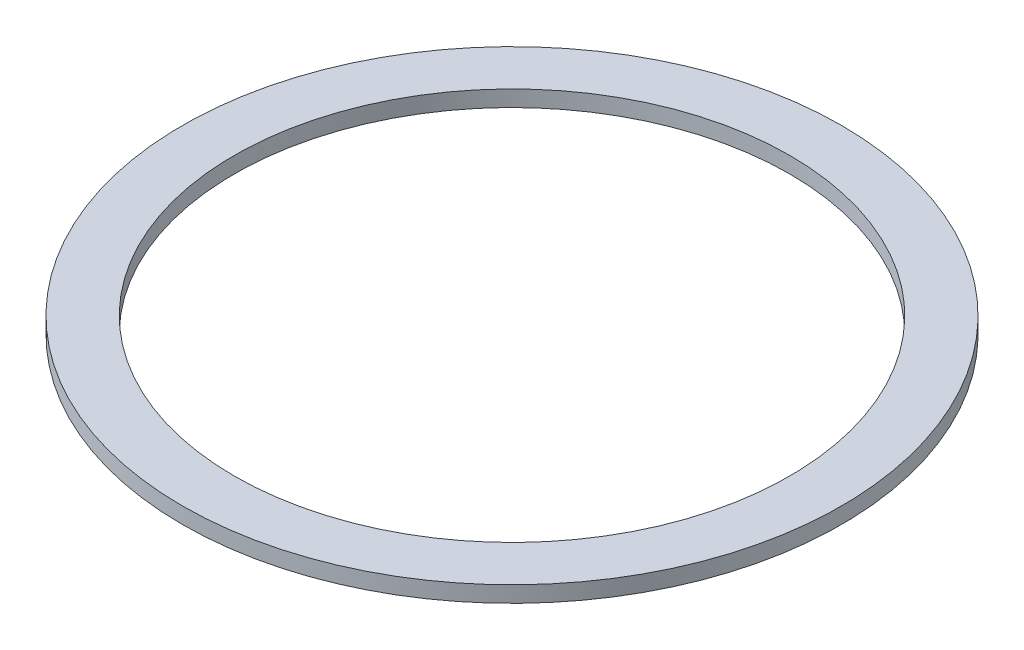
ISO-10303-21;
HEADER;
FILE_DESCRIPTION(('STEP AP214'),'2;1');
FILE_NAME('part.step','',(''),(''),'','','');
FILE_SCHEMA(('AUTOMOTIVE_DESIGN { 1 0 10303 214 1 1 1 1 }'));
ENDSEC;
DATA;
#1=APPLICATION_CONTEXT('core data for automotive mechanical design processes');
#2=APPLICATION_PROTOCOL_DEFINITION('international standard','automotive_design',2000,#1);
#3=PRODUCT_CONTEXT('',#1,'mechanical');
#4=PRODUCT('Part','Part','',(#3));
#5=PRODUCT_RELATED_PRODUCT_CATEGORY('part','',(#4));
#6=PRODUCT_DEFINITION_FORMATION('','',#4);
#7=PRODUCT_DEFINITION_CONTEXT('part definition',#1,'design');
#8=PRODUCT_DEFINITION('design','',#6,#7);
#9=PRODUCT_DEFINITION_SHAPE('','',#8);
#10=(LENGTH_UNIT() NAMED_UNIT(*) SI_UNIT(.MILLI.,.METRE.));
#11=(NAMED_UNIT(*) PLANE_ANGLE_UNIT() SI_UNIT($,.RADIAN.));
#12=(NAMED_UNIT(*) SI_UNIT($,.STERADIAN.) SOLID_ANGLE_UNIT());
#13=UNCERTAINTY_MEASURE_WITH_UNIT(LENGTH_MEASURE(1.E-05),#10,'distance_accuracy_value','');
#14=(GEOMETRIC_REPRESENTATION_CONTEXT(3) GLOBAL_UNCERTAINTY_ASSIGNED_CONTEXT((#13)) GLOBAL_UNIT_ASSIGNED_CONTEXT((#10,
#11,#12)) REPRESENTATION_CONTEXT('',''));
#15=CARTESIAN_POINT('',(0.,0.,0.));
#16=DIRECTION('',(0.,0.,1.));
#17=DIRECTION('',(1.,0.,0.));
#18=AXIS2_PLACEMENT_3D('',#15,#16,#17);
#19=CARTESIAN_POINT('',(0.,1.6,0.));
#20=DIRECTION('',(0.,1.,0.));
#21=DIRECTION('',(0.,0.,1.));
#22=AXIS2_PLACEMENT_3D('',#19,#20,#21);
#23=PLANE('',#22);
#24=CARTESIAN_POINT('',(0.,1.6,0.));
#25=DIRECTION('',(0.,1.,0.));
#26=DIRECTION('',(0.,0.,1.));
#27=AXIS2_PLACEMENT_3D('',#24,#25,#26);
#28=CIRCLE('',#27,32.75);
#29=CARTESIAN_POINT('',(0.,1.6,32.75));
#30=VERTEX_POINT('',#29);
#31=EDGE_CURVE('E10',#30,#30,#28,.T.);
#32=ORIENTED_EDGE('',*,*,#31,.T.);
#33=EDGE_LOOP('',(#32));
#34=FACE_BOUND('',#33,.T.);
#35=CARTESIAN_POINT('',(0.,1.6,0.));
#36=DIRECTION('',(0.,1.,0.));
#37=DIRECTION('',(0.,0.,1.));
#38=AXIS2_PLACEMENT_3D('',#35,#36,#37);
#39=CIRCLE('',#38,27.6);
#40=CARTESIAN_POINT('',(0.,1.6,27.6));
#41=VERTEX_POINT('',#40);
#42=EDGE_CURVE('E42',#41,#41,#39,.T.);
#43=ORIENTED_EDGE('',*,*,#42,.F.);
#44=EDGE_LOOP('',(#43));
#45=FACE_BOUND('',#44,.T.);
#46=ADVANCED_FACE('F31',(#34,#45),#23,.T.);
#47=CARTESIAN_POINT('',(0.,0.,0.));
#48=DIRECTION('',(0.,1.,0.));
#49=DIRECTION('',(0.,0.,1.));
#50=AXIS2_PLACEMENT_3D('',#47,#48,#49);
#51=PLANE('',#50);
#52=CARTESIAN_POINT('',(0.,0.,0.));
#53=DIRECTION('',(0.,1.,0.));
#54=DIRECTION('',(0.,0.,1.));
#55=AXIS2_PLACEMENT_3D('',#52,#53,#54);
#56=CIRCLE('',#55,32.75);
#57=CARTESIAN_POINT('',(0.,0.,32.75));
#58=VERTEX_POINT('',#57);
#59=EDGE_CURVE('E35',#58,#58,#56,.T.);
#60=ORIENTED_EDGE('',*,*,#59,.F.);
#61=EDGE_LOOP('',(#60));
#62=FACE_BOUND('',#61,.T.);
#63=CARTESIAN_POINT('',(0.,0.,0.));
#64=DIRECTION('',(0.,1.,0.));
#65=DIRECTION('',(0.,0.,1.));
#66=AXIS2_PLACEMENT_3D('',#63,#64,#65);
#67=CIRCLE('',#66,27.6);
#68=CARTESIAN_POINT('',(0.,0.,27.6));
#69=VERTEX_POINT('',#68);
#70=EDGE_CURVE('E44',#69,#69,#67,.T.);
#71=ORIENTED_EDGE('',*,*,#70,.T.);
#72=EDGE_LOOP('',(#71));
#73=FACE_BOUND('',#72,.T.);
#74=ADVANCED_FACE('F54',(#62,#73),#51,.F.);
#75=CARTESIAN_POINT('',(0.,1.6,0.));
#76=DIRECTION('',(0.,-1.,0.));
#77=DIRECTION('',(0.,0.,-1.));
#78=AXIS2_PLACEMENT_3D('',#75,#76,#77);
#79=CYLINDRICAL_SURFACE('',#78,32.75);
#80=ORIENTED_EDGE('',*,*,#31,.F.);
#81=EDGE_LOOP('',(#80));
#82=FACE_BOUND('',#81,.T.);
#83=ORIENTED_EDGE('',*,*,#59,.T.);
#84=EDGE_LOOP('',(#83));
#85=FACE_BOUND('',#84,.T.);
#86=ADVANCED_FACE('F33',(#82,#85),#79,.T.);
#87=CARTESIAN_POINT('',(0.,1.6,0.));
#88=DIRECTION('',(0.,-1.,0.));
#89=DIRECTION('',(0.,0.,-1.));
#90=AXIS2_PLACEMENT_3D('',#87,#88,#89);
#91=CYLINDRICAL_SURFACE('',#90,27.6);
#92=ORIENTED_EDGE('',*,*,#42,.T.);
#93=EDGE_LOOP('',(#92));
#94=FACE_BOUND('',#93,.T.);
#95=ORIENTED_EDGE('',*,*,#70,.F.);
#96=EDGE_LOOP('',(#95));
#97=FACE_BOUND('',#96,.T.);
#98=ADVANCED_FACE('F50',(#94,#97),#91,.F.);
#99=CLOSED_SHELL('',(#46,#74,#86,#98));
#100=MANIFOLD_SOLID_BREP('B2',#99);
#101=ADVANCED_BREP_SHAPE_REPRESENTATION('',(#18,#100),#14);
#102=SHAPE_DEFINITION_REPRESENTATION(#9,#101);
ENDSEC;
END-ISO-10303-21;
